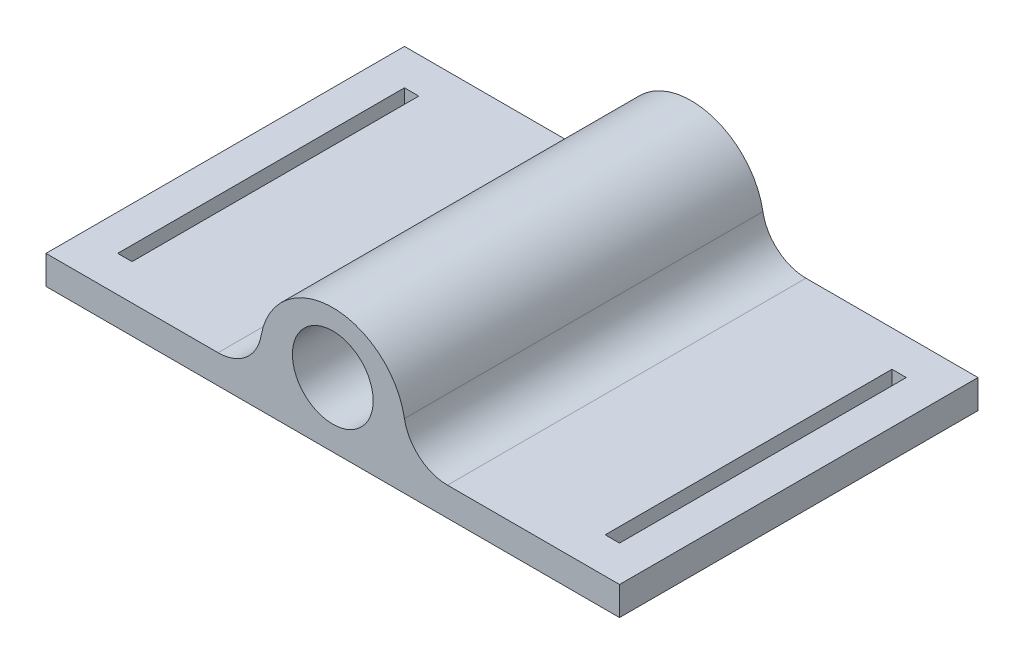
ISO-10303-21;
HEADER;
FILE_DESCRIPTION(('STEP AP214'),'2;1');
FILE_NAME('part.step','',(''),(''),'','','');
FILE_SCHEMA(('AUTOMOTIVE_DESIGN { 1 0 10303 214 1 1 1 1 }'));
ENDSEC;
DATA;
#1=APPLICATION_CONTEXT('core data for automotive mechanical design processes');
#2=APPLICATION_PROTOCOL_DEFINITION('international standard','automotive_design',2000,#1);
#3=PRODUCT_CONTEXT('',#1,'mechanical');
#4=PRODUCT('Part','Part','',(#3));
#5=PRODUCT_RELATED_PRODUCT_CATEGORY('part','',(#4));
#6=PRODUCT_DEFINITION_FORMATION('','',#4);
#7=PRODUCT_DEFINITION_CONTEXT('part definition',#1,'design');
#8=PRODUCT_DEFINITION('design','',#6,#7);
#9=PRODUCT_DEFINITION_SHAPE('','',#8);
#10=(LENGTH_UNIT() NAMED_UNIT(*) SI_UNIT(.MILLI.,.METRE.));
#11=(NAMED_UNIT(*) PLANE_ANGLE_UNIT() SI_UNIT($,.RADIAN.));
#12=(NAMED_UNIT(*) SI_UNIT($,.STERADIAN.) SOLID_ANGLE_UNIT());
#13=UNCERTAINTY_MEASURE_WITH_UNIT(LENGTH_MEASURE(1.E-05),#10,'distance_accuracy_value','');
#14=(GEOMETRIC_REPRESENTATION_CONTEXT(3) GLOBAL_UNCERTAINTY_ASSIGNED_CONTEXT((#13)) GLOBAL_UNIT_ASSIGNED_CONTEXT((#10,
#11,#12)) REPRESENTATION_CONTEXT('',''));
#15=CARTESIAN_POINT('',(0.,0.,0.));
#16=DIRECTION('',(0.,0.,1.));
#17=DIRECTION('',(1.,0.,0.));
#18=AXIS2_PLACEMENT_3D('',#15,#16,#17);
#19=CARTESIAN_POINT('',(-4.12266601838264,0.,25.));
#20=DIRECTION('',(0.,1.,0.));
#21=DIRECTION('',(0.,0.,1.));
#22=AXIS2_PLACEMENT_3D('',#19,#20,#21);
#23=PLANE('',#22);
#24=DIRECTION('',(0.,0.,1.));
#25=VECTOR('',#24,1.);
#26=CARTESIAN_POINT('',(32.3773339816174,0.,2.5));
#27=LINE('',#26,#25);
#28=CARTESIAN_POINT('',(32.3773339816174,0.,2.5));
#29=VERTEX_POINT('',#28);
#30=CARTESIAN_POINT('',(32.3773339816174,0.,22.5));
#31=VERTEX_POINT('',#30);
#32=EDGE_CURVE('E66',#29,#31,#27,.T.);
#33=ORIENTED_EDGE('',*,*,#32,.T.);
#34=DIRECTION('',(1.,0.,0.));
#35=VECTOR('',#34,1.);
#36=CARTESIAN_POINT('',(32.3773339816174,0.,22.5));
#37=LINE('',#36,#35);
#38=CARTESIAN_POINT('',(33.3773339816174,0.,22.5));
#39=VERTEX_POINT('',#38);
#40=EDGE_CURVE('E182',#31,#39,#37,.T.);
#41=ORIENTED_EDGE('',*,*,#40,.T.);
#42=DIRECTION('',(0.,0.,-1.));
#43=VECTOR('',#42,1.);
#44=CARTESIAN_POINT('',(33.3773339816174,0.,2.5));
#45=LINE('',#44,#43);
#46=CARTESIAN_POINT('',(33.3773339816174,0.,2.5));
#47=VERTEX_POINT('',#46);
#48=EDGE_CURVE('E215',#39,#47,#45,.T.);
#49=ORIENTED_EDGE('',*,*,#48,.T.);
#50=DIRECTION('',(-1.,0.,0.));
#51=VECTOR('',#50,1.);
#52=CARTESIAN_POINT('',(32.3773339816174,0.,2.5));
#53=LINE('',#52,#51);
#54=EDGE_CURVE('E211',#47,#29,#53,.T.);
#55=ORIENTED_EDGE('',*,*,#54,.T.);
#56=EDGE_LOOP('',(#33,#41,#49,#55));
#57=FACE_BOUND('',#56,.T.);
#58=DIRECTION('',(1.,0.,0.));
#59=VECTOR('',#58,1.);
#60=CARTESIAN_POINT('',(-4.12266601838264,0.,0.));
#61=LINE('',#60,#59);
#62=CARTESIAN_POINT('',(-4.12266601838264,0.,0.));
#63=VERTEX_POINT('',#62);
#64=CARTESIAN_POINT('',(35.8773339816174,0.,0.));
#65=VERTEX_POINT('',#64);
#66=EDGE_CURVE('E163',#63,#65,#61,.T.);
#67=ORIENTED_EDGE('',*,*,#66,.T.);
#68=DIRECTION('',(0.,0.,-1.));
#69=VECTOR('',#68,1.);
#70=CARTESIAN_POINT('',(35.8773339816174,0.,25.));
#71=LINE('',#70,#69);
#72=CARTESIAN_POINT('',(35.8773339816174,0.,25.));
#73=VERTEX_POINT('',#72);
#74=EDGE_CURVE('E299',#73,#65,#71,.T.);
#75=ORIENTED_EDGE('',*,*,#74,.F.);
#76=DIRECTION('',(1.,0.,0.));
#77=VECTOR('',#76,1.);
#78=CARTESIAN_POINT('',(-4.12266601838264,0.,25.));
#79=LINE('',#78,#77);
#80=CARTESIAN_POINT('',(-4.12266601838264,0.,25.));
#81=VERTEX_POINT('',#80);
#82=EDGE_CURVE('E222',#81,#73,#79,.T.);
#83=ORIENTED_EDGE('',*,*,#82,.F.);
#84=DIRECTION('',(0.,0.,-1.));
#85=VECTOR('',#84,1.);
#86=CARTESIAN_POINT('',(-4.12266601838264,0.,25.));
#87=LINE('',#86,#85);
#88=EDGE_CURVE('E248',#81,#63,#87,.T.);
#89=ORIENTED_EDGE('',*,*,#88,.T.);
#90=EDGE_LOOP('',(#67,#75,#83,#89));
#91=FACE_BOUND('',#90,.T.);
#92=DIRECTION('',(0.,0.,1.));
#93=VECTOR('',#92,1.);
#94=CARTESIAN_POINT('',(-1.62266601838264,0.,2.5));
#95=LINE('',#94,#93);
#96=CARTESIAN_POINT('',(-1.62266601838264,0.,2.5));
#97=VERTEX_POINT('',#96);
#98=CARTESIAN_POINT('',(-1.62266601838264,0.,22.5));
#99=VERTEX_POINT('',#98);
#100=EDGE_CURVE('E58',#97,#99,#95,.T.);
#101=ORIENTED_EDGE('',*,*,#100,.T.);
#102=DIRECTION('',(1.,0.,0.));
#103=VECTOR('',#102,1.);
#104=CARTESIAN_POINT('',(-1.62266601838264,0.,22.5));
#105=LINE('',#104,#103);
#106=CARTESIAN_POINT('',(-0.622666018382639,0.,22.5));
#107=VERTEX_POINT('',#106);
#108=EDGE_CURVE('E167',#99,#107,#105,.T.);
#109=ORIENTED_EDGE('',*,*,#108,.T.);
#110=DIRECTION('',(0.,0.,-1.));
#111=VECTOR('',#110,1.);
#112=CARTESIAN_POINT('',(-0.622666018382641,0.,2.5));
#113=LINE('',#112,#111);
#114=CARTESIAN_POINT('',(-0.622666018382641,0.,2.5));
#115=VERTEX_POINT('',#114);
#116=EDGE_CURVE('E174',#107,#115,#113,.T.);
#117=ORIENTED_EDGE('',*,*,#116,.T.);
#118=DIRECTION('',(-1.,0.,0.));
#119=VECTOR('',#118,1.);
#120=CARTESIAN_POINT('',(-1.62266601838264,0.,2.5));
#121=LINE('',#120,#119);
#122=EDGE_CURVE('E178',#115,#97,#121,.T.);
#123=ORIENTED_EDGE('',*,*,#122,.T.);
#124=EDGE_LOOP('',(#101,#109,#117,#123));
#125=FACE_BOUND('',#124,.T.);
#126=ADVANCED_FACE('F42',(#57,#91,#125),#23,.F.);
#127=CARTESIAN_POINT('',(35.8773339816174,2.,25.));
#128=DIRECTION('',(0.,-1.,0.));
#129=DIRECTION('',(1.,0.,0.));
#130=AXIS2_PLACEMENT_3D('',#127,#128,#129);
#131=PLANE('',#130);
#132=DIRECTION('',(-1.,0.,0.));
#133=VECTOR('',#132,1.);
#134=CARTESIAN_POINT('',(35.8773339816174,2.,0.));
#135=LINE('',#134,#133);
#136=CARTESIAN_POINT('',(35.8773339816174,2.,0.));
#137=VERTEX_POINT('',#136);
#138=CARTESIAN_POINT('',(23.8773339816174,2.,0.));
#139=VERTEX_POINT('',#138);
#140=EDGE_CURVE('E255',#137,#139,#135,.T.);
#141=ORIENTED_EDGE('',*,*,#140,.T.);
#142=DIRECTION('',(0.,0.,-1.));
#143=VECTOR('',#142,1.);
#144=CARTESIAN_POINT('',(23.8773339816174,2.,25.));
#145=LINE('',#144,#143);
#146=CARTESIAN_POINT('',(23.8773339816174,2.,25.));
#147=VERTEX_POINT('',#146);
#148=EDGE_CURVE('E291',#147,#139,#145,.T.);
#149=ORIENTED_EDGE('',*,*,#148,.F.);
#150=DIRECTION('',(-1.,0.,0.));
#151=VECTOR('',#150,1.);
#152=CARTESIAN_POINT('',(35.8773339816174,2.,25.));
#153=LINE('',#152,#151);
#154=CARTESIAN_POINT('',(35.8773339816174,2.,25.));
#155=VERTEX_POINT('',#154);
#156=EDGE_CURVE('E230',#155,#147,#153,.T.);
#157=ORIENTED_EDGE('',*,*,#156,.F.);
#158=DIRECTION('',(0.,0.,-1.));
#159=VECTOR('',#158,1.);
#160=CARTESIAN_POINT('',(35.8773339816174,2.,25.));
#161=LINE('',#160,#159);
#162=EDGE_CURVE('E295',#155,#137,#161,.T.);
#163=ORIENTED_EDGE('',*,*,#162,.T.);
#164=EDGE_LOOP('',(#141,#149,#157,#163));
#165=FACE_BOUND('',#164,.T.);
#166=DIRECTION('',(0.,0.,1.));
#167=VECTOR('',#166,1.);
#168=CARTESIAN_POINT('',(32.3773339816174,2.,25.));
#169=LINE('',#168,#167);
#170=CARTESIAN_POINT('',(32.3773339816174,2.,2.5));
#171=VERTEX_POINT('',#170);
#172=CARTESIAN_POINT('',(32.3773339816174,2.,22.5));
#173=VERTEX_POINT('',#172);
#174=EDGE_CURVE('E11',#171,#173,#169,.T.);
#175=ORIENTED_EDGE('',*,*,#174,.F.);
#176=DIRECTION('',(-1.,0.,0.));
#177=VECTOR('',#176,1.);
#178=CARTESIAN_POINT('',(35.8773339816174,2.,2.5));
#179=LINE('',#178,#177);
#180=CARTESIAN_POINT('',(33.3773339816174,2.,2.5));
#181=VERTEX_POINT('',#180);
#182=EDGE_CURVE('E315',#181,#171,#179,.T.);
#183=ORIENTED_EDGE('',*,*,#182,.F.);
#184=DIRECTION('',(0.,0.,-1.));
#185=VECTOR('',#184,1.);
#186=CARTESIAN_POINT('',(33.3773339816174,2.,25.));
#187=LINE('',#186,#185);
#188=CARTESIAN_POINT('',(33.3773339816174,2.,22.5));
#189=VERTEX_POINT('',#188);
#190=EDGE_CURVE('E318',#189,#181,#187,.T.);
#191=ORIENTED_EDGE('',*,*,#190,.F.);
#192=DIRECTION('',(1.,0.,0.));
#193=VECTOR('',#192,1.);
#194=CARTESIAN_POINT('',(35.8773339816174,2.,22.5));
#195=LINE('',#194,#193);
#196=EDGE_CURVE('E51',#173,#189,#195,.T.);
#197=ORIENTED_EDGE('',*,*,#196,.F.);
#198=EDGE_LOOP('',(#175,#183,#191,#197));
#199=FACE_BOUND('',#198,.T.);
#200=ADVANCED_FACE('F336',(#165,#199),#131,.F.);
#201=CARTESIAN_POINT('',(-4.12266601838264,2.,25.));
#202=DIRECTION('',(0.,-1.,0.));
#203=DIRECTION('',(1.,0.,0.));
#204=AXIS2_PLACEMENT_3D('',#201,#202,#203);
#205=PLANE('',#204);
#206=DIRECTION('',(-1.,0.,0.));
#207=VECTOR('',#206,1.);
#208=CARTESIAN_POINT('',(-4.12266601838264,2.,0.));
#209=LINE('',#208,#207);
#210=CARTESIAN_POINT('',(7.87733398161736,2.,0.));
#211=VERTEX_POINT('',#210);
#212=CARTESIAN_POINT('',(-4.12266601838264,2.,0.));
#213=VERTEX_POINT('',#212);
#214=EDGE_CURVE('E267',#211,#213,#209,.T.);
#215=ORIENTED_EDGE('',*,*,#214,.T.);
#216=DIRECTION('',(0.,0.,-1.));
#217=VECTOR('',#216,1.);
#218=CARTESIAN_POINT('',(-4.12266601838264,2.,25.));
#219=LINE('',#218,#217);
#220=CARTESIAN_POINT('',(-4.12266601838264,2.,25.));
#221=VERTEX_POINT('',#220);
#222=EDGE_CURVE('E275',#221,#213,#219,.T.);
#223=ORIENTED_EDGE('',*,*,#222,.F.);
#224=DIRECTION('',(-1.,0.,0.));
#225=VECTOR('',#224,1.);
#226=CARTESIAN_POINT('',(-4.12266601838264,2.,25.));
#227=LINE('',#226,#225);
#228=CARTESIAN_POINT('',(7.87733398161736,2.,25.));
#229=VERTEX_POINT('',#228);
#230=EDGE_CURVE('E242',#229,#221,#227,.T.);
#231=ORIENTED_EDGE('',*,*,#230,.F.);
#232=DIRECTION('',(0.,0.,-1.));
#233=VECTOR('',#232,1.);
#234=CARTESIAN_POINT('',(7.87733398161736,2.,25.));
#235=LINE('',#234,#233);
#236=EDGE_CURVE('E279',#229,#211,#235,.T.);
#237=ORIENTED_EDGE('',*,*,#236,.T.);
#238=EDGE_LOOP('',(#215,#223,#231,#237));
#239=FACE_BOUND('',#238,.T.);
#240=DIRECTION('',(0.,0.,1.));
#241=VECTOR('',#240,1.);
#242=CARTESIAN_POINT('',(-1.62266601838264,2.,25.));
#243=LINE('',#242,#241);
#244=CARTESIAN_POINT('',(-1.62266601838264,2.,2.5));
#245=VERTEX_POINT('',#244);
#246=CARTESIAN_POINT('',(-1.62266601838264,2.,22.5));
#247=VERTEX_POINT('',#246);
#248=EDGE_CURVE('E159',#245,#247,#243,.T.);
#249=ORIENTED_EDGE('',*,*,#248,.F.);
#250=DIRECTION('',(-1.,0.,0.));
#251=VECTOR('',#250,1.);
#252=CARTESIAN_POINT('',(-4.12266601838263,2.,2.5));
#253=LINE('',#252,#251);
#254=CARTESIAN_POINT('',(-0.622666018382641,2.,2.5));
#255=VERTEX_POINT('',#254);
#256=EDGE_CURVE('E303',#255,#245,#253,.T.);
#257=ORIENTED_EDGE('',*,*,#256,.F.);
#258=DIRECTION('',(0.,0.,-1.));
#259=VECTOR('',#258,1.);
#260=CARTESIAN_POINT('',(-0.622666018382638,2.,25.));
#261=LINE('',#260,#259);
#262=CARTESIAN_POINT('',(-0.622666018382639,2.,22.5));
#263=VERTEX_POINT('',#262);
#264=EDGE_CURVE('E306',#263,#255,#261,.T.);
#265=ORIENTED_EDGE('',*,*,#264,.F.);
#266=DIRECTION('',(1.,0.,0.));
#267=VECTOR('',#266,1.);
#268=CARTESIAN_POINT('',(-4.12266601838264,2.,22.5));
#269=LINE('',#268,#267);
#270=EDGE_CURVE('E310',#247,#263,#269,.T.);
#271=ORIENTED_EDGE('',*,*,#270,.F.);
#272=EDGE_LOOP('',(#249,#257,#265,#271));
#273=FACE_BOUND('',#272,.T.);
#274=ADVANCED_FACE('F366',(#239,#273),#205,.F.);
#275=CARTESIAN_POINT('',(35.8773339816174,0.,25.));
#276=DIRECTION('',(-1.,0.,0.));
#277=DIRECTION('',(0.,0.,1.));
#278=AXIS2_PLACEMENT_3D('',#275,#276,#277);
#279=PLANE('',#278);
#280=DIRECTION('',(0.,1.,0.));
#281=VECTOR('',#280,1.);
#282=CARTESIAN_POINT('',(35.8773339816174,0.,0.));
#283=LINE('',#282,#281);
#284=EDGE_CURVE('E252',#65,#137,#283,.T.);
#285=ORIENTED_EDGE('',*,*,#284,.T.);
#286=ORIENTED_EDGE('',*,*,#162,.F.);
#287=DIRECTION('',(0.,1.,0.));
#288=VECTOR('',#287,1.);
#289=CARTESIAN_POINT('',(35.8773339816174,0.,25.));
#290=LINE('',#289,#288);
#291=EDGE_CURVE('E226',#73,#155,#290,.T.);
#292=ORIENTED_EDGE('',*,*,#291,.F.);
#293=ORIENTED_EDGE('',*,*,#74,.T.);
#294=EDGE_LOOP('',(#285,#286,#292,#293));
#295=FACE_BOUND('',#294,.T.);
#296=ADVANCED_FACE('F356',(#295),#279,.F.);
#297=CARTESIAN_POINT('',(23.8773339816174,5.04534569508334,25.));
#298=DIRECTION('',(0.,0.,-1.));
#299=DIRECTION('',(-1.,0.,0.));
#300=AXIS2_PLACEMENT_3D('',#297,#298,#299);
#301=CYLINDRICAL_SURFACE('',#300,3.04534569508334);
#302=CARTESIAN_POINT('',(23.8773339816174,5.04534569508334,0.));
#303=DIRECTION('',(0.,0.,-1.));
#304=DIRECTION('',(-1.,0.,0.));
#305=AXIS2_PLACEMENT_3D('',#302,#303,#304);
#306=CIRCLE('',#305,3.04534569508334);
#307=CARTESIAN_POINT('',(20.8773339816174,4.52177105612284,0.));
#308=VERTEX_POINT('',#307);
#309=EDGE_CURVE('E258',#139,#308,#306,.T.);
#310=ORIENTED_EDGE('',*,*,#309,.T.);
#311=DIRECTION('',(0.,0.,-1.));
#312=VECTOR('',#311,1.);
#313=CARTESIAN_POINT('',(20.8773339816174,4.52177105612284,25.));
#314=LINE('',#313,#312);
#315=CARTESIAN_POINT('',(20.8773339816174,4.52177105612284,25.));
#316=VERTEX_POINT('',#315);
#317=EDGE_CURVE('E287',#316,#308,#314,.T.);
#318=ORIENTED_EDGE('',*,*,#317,.F.);
#319=CARTESIAN_POINT('',(23.8773339816174,5.04534569508334,25.));
#320=DIRECTION('',(0.,0.,-1.));
#321=DIRECTION('',(-1.,0.,0.));
#322=AXIS2_PLACEMENT_3D('',#319,#320,#321);
#323=CIRCLE('',#322,3.04534569508334);
#324=EDGE_CURVE('E233',#147,#316,#323,.T.);
#325=ORIENTED_EDGE('',*,*,#324,.F.);
#326=ORIENTED_EDGE('',*,*,#148,.T.);
#327=EDGE_LOOP('',(#310,#318,#325,#326));
#328=FACE_BOUND('',#327,.T.);
#329=ADVANCED_FACE('F381',(#328),#301,.F.);
#330=CARTESIAN_POINT('',(15.8773339816174,3.64914665785534,25.));
#331=DIRECTION('',(0.,0.,-1.));
#332=DIRECTION('',(-1.,0.,0.));
#333=AXIS2_PLACEMENT_3D('',#330,#331,#332);
#334=CYLINDRICAL_SURFACE('',#333,5.07557615847223);
#335=CARTESIAN_POINT('',(15.8773339816174,3.64914665785534,0.));
#336=DIRECTION('',(0.,0.,1.));
#337=DIRECTION('',(-1.,0.,0.));
#338=AXIS2_PLACEMENT_3D('',#335,#336,#337);
#339=CIRCLE('',#338,5.07557615847223);
#340=CARTESIAN_POINT('',(10.8773339816174,4.52177105612284,0.));
#341=VERTEX_POINT('',#340);
#342=EDGE_CURVE('E261',#308,#341,#339,.T.);
#343=ORIENTED_EDGE('',*,*,#342,.T.);
#344=DIRECTION('',(0.,0.,-1.));
#345=VECTOR('',#344,1.);
#346=CARTESIAN_POINT('',(10.8773339816174,4.52177105612284,25.));
#347=LINE('',#346,#345);
#348=CARTESIAN_POINT('',(10.8773339816174,4.52177105612284,25.));
#349=VERTEX_POINT('',#348);
#350=EDGE_CURVE('E283',#349,#341,#347,.T.);
#351=ORIENTED_EDGE('',*,*,#350,.F.);
#352=CARTESIAN_POINT('',(15.8773339816174,3.64914665785534,25.));
#353=DIRECTION('',(0.,0.,1.));
#354=DIRECTION('',(-1.,0.,0.));
#355=AXIS2_PLACEMENT_3D('',#352,#353,#354);
#356=CIRCLE('',#355,5.07557615847223);
#357=EDGE_CURVE('E236',#316,#349,#356,.T.);
#358=ORIENTED_EDGE('',*,*,#357,.F.);
#359=ORIENTED_EDGE('',*,*,#317,.T.);
#360=EDGE_LOOP('',(#343,#351,#358,#359));
#361=FACE_BOUND('',#360,.T.);
#362=ADVANCED_FACE('F377',(#361),#334,.T.);
#363=CARTESIAN_POINT('',(7.87733398161736,5.04534569508334,25.));
#364=DIRECTION('',(0.,0.,-1.));
#365=DIRECTION('',(-1.,0.,0.));
#366=AXIS2_PLACEMENT_3D('',#363,#364,#365);
#367=CYLINDRICAL_SURFACE('',#366,3.04534569508334);
#368=CARTESIAN_POINT('',(7.87733398161736,5.04534569508334,0.));
#369=DIRECTION('',(0.,0.,-1.));
#370=DIRECTION('',(1.,0.,0.));
#371=AXIS2_PLACEMENT_3D('',#368,#369,#370);
#372=CIRCLE('',#371,3.04534569508334);
#373=EDGE_CURVE('E264',#341,#211,#372,.T.);
#374=ORIENTED_EDGE('',*,*,#373,.T.);
#375=ORIENTED_EDGE('',*,*,#236,.F.);
#376=CARTESIAN_POINT('',(7.87733398161736,5.04534569508334,25.));
#377=DIRECTION('',(0.,0.,-1.));
#378=DIRECTION('',(1.,0.,0.));
#379=AXIS2_PLACEMENT_3D('',#376,#377,#378);
#380=CIRCLE('',#379,3.04534569508334);
#381=EDGE_CURVE('E239',#349,#229,#380,.T.);
#382=ORIENTED_EDGE('',*,*,#381,.F.);
#383=ORIENTED_EDGE('',*,*,#350,.T.);
#384=EDGE_LOOP('',(#374,#375,#382,#383));
#385=FACE_BOUND('',#384,.T.);
#386=ADVANCED_FACE('F372',(#385),#367,.F.);
#387=CARTESIAN_POINT('',(-4.12266601838264,0.,25.));
#388=DIRECTION('',(1.,0.,0.));
#389=DIRECTION('',(0.,0.,-1.));
#390=AXIS2_PLACEMENT_3D('',#387,#388,#389);
#391=PLANE('',#390);
#392=DIRECTION('',(0.,-1.,0.));
#393=VECTOR('',#392,1.);
#394=CARTESIAN_POINT('',(-4.12266601838264,0.,0.));
#395=LINE('',#394,#393);
#396=EDGE_CURVE('E227',#213,#63,#395,.T.);
#397=ORIENTED_EDGE('',*,*,#396,.T.);
#398=ORIENTED_EDGE('',*,*,#88,.F.);
#399=DIRECTION('',(0.,-1.,0.));
#400=VECTOR('',#399,1.);
#401=CARTESIAN_POINT('',(-4.12266601838264,0.,25.));
#402=LINE('',#401,#400);
#403=EDGE_CURVE('E245',#221,#81,#402,.T.);
#404=ORIENTED_EDGE('',*,*,#403,.F.);
#405=ORIENTED_EDGE('',*,*,#222,.T.);
#406=EDGE_LOOP('',(#397,#398,#404,#405));
#407=FACE_BOUND('',#406,.T.);
#408=ADVANCED_FACE('F364',(#407),#391,.F.);
#409=CARTESIAN_POINT('',(23.8773339816174,5.04534569508334,25.));
#410=DIRECTION('',(0.,0.,-1.));
#411=DIRECTION('',(-1.,0.,0.));
#412=AXIS2_PLACEMENT_3D('',#409,#410,#411);
#413=PLANE('',#412);
#414=CARTESIAN_POINT('',(15.8773339816174,4.5,25.));
#415=DIRECTION('',(0.,0.,1.));
#416=DIRECTION('',(1.,0.,0.));
#417=AXIS2_PLACEMENT_3D('',#414,#415,#416);
#418=CIRCLE('',#417,2.81717478210793);
#419=CARTESIAN_POINT('',(18.6945087637253,4.5,25.));
#420=VERTEX_POINT('',#419);
#421=EDGE_CURVE('E185',#420,#420,#418,.T.);
#422=ORIENTED_EDGE('',*,*,#421,.F.);
#423=EDGE_LOOP('',(#422));
#424=FACE_BOUND('',#423,.T.);
#425=ORIENTED_EDGE('',*,*,#82,.T.);
#426=ORIENTED_EDGE('',*,*,#291,.T.);
#427=ORIENTED_EDGE('',*,*,#156,.T.);
#428=ORIENTED_EDGE('',*,*,#324,.T.);
#429=ORIENTED_EDGE('',*,*,#357,.T.);
#430=ORIENTED_EDGE('',*,*,#381,.T.);
#431=ORIENTED_EDGE('',*,*,#230,.T.);
#432=ORIENTED_EDGE('',*,*,#403,.T.);
#433=EDGE_LOOP('',(#425,#426,#427,#428,#429,#430,#431,#432));
#434=FACE_BOUND('',#433,.T.);
#435=ADVANCED_FACE('F359',(#424,#434),#413,.F.);
#436=CARTESIAN_POINT('',(23.8773339816174,5.04534569508334,0.));
#437=DIRECTION('',(0.,0.,-1.));
#438=DIRECTION('',(-1.,0.,0.));
#439=AXIS2_PLACEMENT_3D('',#436,#437,#438);
#440=PLANE('',#439);
#441=CARTESIAN_POINT('',(15.8773339816174,4.5,0.));
#442=DIRECTION('',(0.,0.,-1.));
#443=DIRECTION('',(-1.,0.,0.));
#444=AXIS2_PLACEMENT_3D('',#441,#442,#443);
#445=CIRCLE('',#444,2.81717478210793);
#446=CARTESIAN_POINT('',(13.0601591995094,4.5,0.));
#447=VERTEX_POINT('',#446);
#448=EDGE_CURVE('E45',#447,#447,#445,.T.);
#449=ORIENTED_EDGE('',*,*,#448,.F.);
#450=EDGE_LOOP('',(#449));
#451=FACE_BOUND('',#450,.T.);
#452=ORIENTED_EDGE('',*,*,#66,.F.);
#453=ORIENTED_EDGE('',*,*,#396,.F.);
#454=ORIENTED_EDGE('',*,*,#214,.F.);
#455=ORIENTED_EDGE('',*,*,#373,.F.);
#456=ORIENTED_EDGE('',*,*,#342,.F.);
#457=ORIENTED_EDGE('',*,*,#309,.F.);
#458=ORIENTED_EDGE('',*,*,#140,.F.);
#459=ORIENTED_EDGE('',*,*,#284,.F.);
#460=EDGE_LOOP('',(#452,#453,#454,#455,#456,#457,#458,#459));
#461=FACE_BOUND('',#460,.T.);
#462=ADVANCED_FACE('F350',(#451,#461),#440,.T.);
#463=CARTESIAN_POINT('',(-1.62266601838264,5.00000000000001,2.5));
#464=DIRECTION('',(1.,0.,0.));
#465=DIRECTION('',(0.,0.,-1.));
#466=AXIS2_PLACEMENT_3D('',#463,#464,#465);
#467=PLANE('',#466);
#468=ORIENTED_EDGE('',*,*,#248,.T.);
#469=DIRECTION('',(0.,-1.,0.));
#470=VECTOR('',#469,1.);
#471=CARTESIAN_POINT('',(-1.62266601838264,5.00000000000001,22.5));
#472=LINE('',#471,#470);
#473=EDGE_CURVE('E155',#247,#99,#472,.T.);
#474=ORIENTED_EDGE('',*,*,#473,.T.);
#475=ORIENTED_EDGE('',*,*,#100,.F.);
#476=DIRECTION('',(0.,-1.,0.));
#477=VECTOR('',#476,1.);
#478=CARTESIAN_POINT('',(-1.62266601838264,5.00000000000001,2.5));
#479=LINE('',#478,#477);
#480=EDGE_CURVE('E191',#245,#97,#479,.T.);
#481=ORIENTED_EDGE('',*,*,#480,.F.);
#482=EDGE_LOOP('',(#468,#474,#475,#481));
#483=FACE_BOUND('',#482,.T.);
#484=ADVANCED_FACE('F157',(#483),#467,.T.);
#485=CARTESIAN_POINT('',(-1.62266601838264,5.00000000000001,22.5));
#486=DIRECTION('',(0.,0.,-1.));
#487=DIRECTION('',(-1.,0.,0.));
#488=AXIS2_PLACEMENT_3D('',#485,#486,#487);
#489=PLANE('',#488);
#490=ORIENTED_EDGE('',*,*,#270,.T.);
#491=DIRECTION('',(0.,-1.,0.));
#492=VECTOR('',#491,1.);
#493=CARTESIAN_POINT('',(-0.622666018382639,5.00000000000001,22.5));
#494=LINE('',#493,#492);
#495=EDGE_CURVE('E164',#263,#107,#494,.T.);
#496=ORIENTED_EDGE('',*,*,#495,.T.);
#497=ORIENTED_EDGE('',*,*,#108,.F.);
#498=ORIENTED_EDGE('',*,*,#473,.F.);
#499=EDGE_LOOP('',(#490,#496,#497,#498));
#500=FACE_BOUND('',#499,.T.);
#501=ADVANCED_FACE('F168',(#500),#489,.T.);
#502=CARTESIAN_POINT('',(-0.622666018382641,5.00000000000001,2.5));
#503=DIRECTION('',(-1.,0.,0.));
#504=DIRECTION('',(0.,0.,1.));
#505=AXIS2_PLACEMENT_3D('',#502,#503,#504);
#506=PLANE('',#505);
#507=ORIENTED_EDGE('',*,*,#264,.T.);
#508=DIRECTION('',(0.,-1.,0.));
#509=VECTOR('',#508,1.);
#510=CARTESIAN_POINT('',(-0.622666018382641,5.00000000000001,2.5));
#511=LINE('',#510,#509);
#512=EDGE_CURVE('E194',#255,#115,#511,.T.);
#513=ORIENTED_EDGE('',*,*,#512,.T.);
#514=ORIENTED_EDGE('',*,*,#116,.F.);
#515=ORIENTED_EDGE('',*,*,#495,.F.);
#516=EDGE_LOOP('',(#507,#513,#514,#515));
#517=FACE_BOUND('',#516,.T.);
#518=ADVANCED_FACE('F426',(#517),#506,.T.);
#519=CARTESIAN_POINT('',(-1.62266601838264,5.00000000000001,2.5));
#520=DIRECTION('',(0.,0.,1.));
#521=DIRECTION('',(1.,0.,0.));
#522=AXIS2_PLACEMENT_3D('',#519,#520,#521);
#523=PLANE('',#522);
#524=ORIENTED_EDGE('',*,*,#256,.T.);
#525=ORIENTED_EDGE('',*,*,#480,.T.);
#526=ORIENTED_EDGE('',*,*,#122,.F.);
#527=ORIENTED_EDGE('',*,*,#512,.F.);
#528=EDGE_LOOP('',(#524,#525,#526,#527));
#529=FACE_BOUND('',#528,.T.);
#530=ADVANCED_FACE('F421',(#529),#523,.T.);
#531=CARTESIAN_POINT('',(32.3773339816174,5.00000000000001,2.5));
#532=DIRECTION('',(1.,0.,0.));
#533=DIRECTION('',(0.,0.,-1.));
#534=AXIS2_PLACEMENT_3D('',#531,#532,#533);
#535=PLANE('',#534);
#536=ORIENTED_EDGE('',*,*,#174,.T.);
#537=DIRECTION('',(0.,-1.,0.));
#538=VECTOR('',#537,1.);
#539=CARTESIAN_POINT('',(32.3773339816174,5.00000000000001,22.5));
#540=LINE('',#539,#538);
#541=EDGE_CURVE('E199',#173,#31,#540,.T.);
#542=ORIENTED_EDGE('',*,*,#541,.T.);
#543=ORIENTED_EDGE('',*,*,#32,.F.);
#544=DIRECTION('',(0.,-1.,0.));
#545=VECTOR('',#544,1.);
#546=CARTESIAN_POINT('',(32.3773339816174,5.00000000000001,2.5));
#547=LINE('',#546,#545);
#548=EDGE_CURVE('E208',#171,#29,#547,.T.);
#549=ORIENTED_EDGE('',*,*,#548,.F.);
#550=EDGE_LOOP('',(#536,#542,#543,#549));
#551=FACE_BOUND('',#550,.T.);
#552=ADVANCED_FACE('F340',(#551),#535,.T.);
#553=CARTESIAN_POINT('',(32.3773339816174,5.00000000000001,22.5));
#554=DIRECTION('',(0.,0.,-1.));
#555=DIRECTION('',(-1.,0.,0.));
#556=AXIS2_PLACEMENT_3D('',#553,#554,#555);
#557=PLANE('',#556);
#558=ORIENTED_EDGE('',*,*,#196,.T.);
#559=DIRECTION('',(0.,-1.,0.));
#560=VECTOR('',#559,1.);
#561=CARTESIAN_POINT('',(33.3773339816174,5.00000000000001,22.5));
#562=LINE('',#561,#560);
#563=EDGE_CURVE('E202',#189,#39,#562,.T.);
#564=ORIENTED_EDGE('',*,*,#563,.T.);
#565=ORIENTED_EDGE('',*,*,#40,.F.);
#566=ORIENTED_EDGE('',*,*,#541,.F.);
#567=EDGE_LOOP('',(#558,#564,#565,#566));
#568=FACE_BOUND('',#567,.T.);
#569=ADVANCED_FACE('F327',(#568),#557,.T.);
#570=CARTESIAN_POINT('',(33.3773339816174,5.00000000000001,2.5));
#571=DIRECTION('',(-1.,0.,0.));
#572=DIRECTION('',(0.,0.,1.));
#573=AXIS2_PLACEMENT_3D('',#570,#571,#572);
#574=PLANE('',#573);
#575=ORIENTED_EDGE('',*,*,#190,.T.);
#576=DIRECTION('',(0.,-1.,0.));
#577=VECTOR('',#576,1.);
#578=CARTESIAN_POINT('',(33.3773339816174,5.00000000000001,2.5));
#579=LINE('',#578,#577);
#580=EDGE_CURVE('E205',#181,#47,#579,.T.);
#581=ORIENTED_EDGE('',*,*,#580,.T.);
#582=ORIENTED_EDGE('',*,*,#48,.F.);
#583=ORIENTED_EDGE('',*,*,#563,.F.);
#584=EDGE_LOOP('',(#575,#581,#582,#583));
#585=FACE_BOUND('',#584,.T.);
#586=ADVANCED_FACE('F334',(#585),#574,.T.);
#587=CARTESIAN_POINT('',(32.3773339816174,5.00000000000001,2.5));
#588=DIRECTION('',(0.,0.,1.));
#589=DIRECTION('',(1.,0.,0.));
#590=AXIS2_PLACEMENT_3D('',#587,#588,#589);
#591=PLANE('',#590);
#592=ORIENTED_EDGE('',*,*,#182,.T.);
#593=ORIENTED_EDGE('',*,*,#548,.T.);
#594=ORIENTED_EDGE('',*,*,#54,.F.);
#595=ORIENTED_EDGE('',*,*,#580,.F.);
#596=EDGE_LOOP('',(#592,#593,#594,#595));
#597=FACE_BOUND('',#596,.T.);
#598=ADVANCED_FACE('F338',(#597),#591,.T.);
#599=CARTESIAN_POINT('',(15.8773339816174,4.5,-11.));
#600=DIRECTION('',(0.,0.,1.));
#601=DIRECTION('',(1.,0.,0.));
#602=AXIS2_PLACEMENT_3D('',#599,#600,#601);
#603=CYLINDRICAL_SURFACE('',#602,2.81717478210793);
#604=ORIENTED_EDGE('',*,*,#448,.T.);
#605=EDGE_LOOP('',(#604));
#606=FACE_BOUND('',#605,.T.);
#607=ORIENTED_EDGE('',*,*,#421,.T.);
#608=EDGE_LOOP('',(#607));
#609=FACE_BOUND('',#608,.T.);
#610=ADVANCED_FACE('F414',(#606,#609),#603,.F.);
#611=CLOSED_SHELL('',(#126,#200,#274,#296,#329,#362,#386,#408,#435,#462,#484,#501,#518,#530,
#552,#569,#586,#598,#610));
#612=MANIFOLD_SOLID_BREP('B2',#611);
#613=ADVANCED_BREP_SHAPE_REPRESENTATION('',(#18,#612),#14);
#614=SHAPE_DEFINITION_REPRESENTATION(#9,#613);
ENDSEC;
END-ISO-10303-21;
